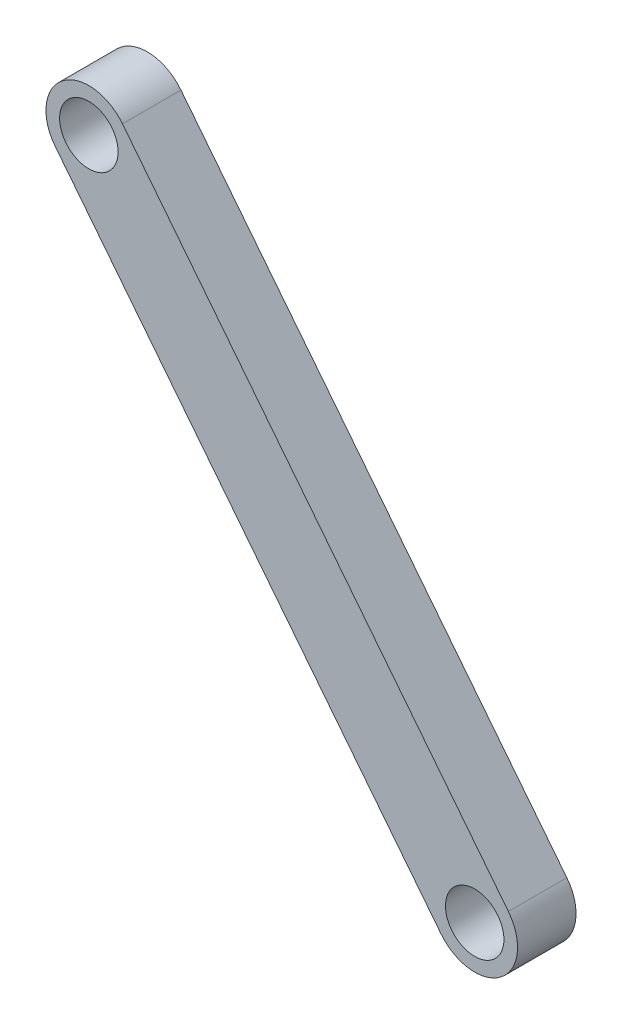
ISO-10303-21;
HEADER;
FILE_DESCRIPTION(('STEP AP214'),'2;1');
FILE_NAME('part.step','',(''),(''),'','','');
FILE_SCHEMA(('AUTOMOTIVE_DESIGN { 1 0 10303 214 1 1 1 1 }'));
ENDSEC;
DATA;
#1=APPLICATION_CONTEXT('core data for automotive mechanical design processes');
#2=APPLICATION_PROTOCOL_DEFINITION('international standard','automotive_design',2000,#1);
#3=PRODUCT_CONTEXT('',#1,'mechanical');
#4=PRODUCT('Part','Part','',(#3));
#5=PRODUCT_RELATED_PRODUCT_CATEGORY('part','',(#4));
#6=PRODUCT_DEFINITION_FORMATION('','',#4);
#7=PRODUCT_DEFINITION_CONTEXT('part definition',#1,'design');
#8=PRODUCT_DEFINITION('design','',#6,#7);
#9=PRODUCT_DEFINITION_SHAPE('','',#8);
#10=(LENGTH_UNIT() NAMED_UNIT(*) SI_UNIT(.MILLI.,.METRE.));
#11=(NAMED_UNIT(*) PLANE_ANGLE_UNIT() SI_UNIT($,.RADIAN.));
#12=(NAMED_UNIT(*) SI_UNIT($,.STERADIAN.) SOLID_ANGLE_UNIT());
#13=UNCERTAINTY_MEASURE_WITH_UNIT(LENGTH_MEASURE(1.E-05),#10,'distance_accuracy_value','');
#14=(GEOMETRIC_REPRESENTATION_CONTEXT(3) GLOBAL_UNCERTAINTY_ASSIGNED_CONTEXT((#13)) GLOBAL_UNIT_ASSIGNED_CONTEXT((#10,
#11,#12)) REPRESENTATION_CONTEXT('',''));
#15=CARTESIAN_POINT('',(0.,0.,0.));
#16=DIRECTION('',(0.,0.,1.));
#17=DIRECTION('',(1.,0.,0.));
#18=AXIS2_PLACEMENT_3D('',#15,#16,#17);
#19=CARTESIAN_POINT('',(0.,0.,3.));
#20=DIRECTION('',(0.,0.,1.));
#21=DIRECTION('',(1.,0.,0.));
#22=AXIS2_PLACEMENT_3D('',#19,#20,#21);
#23=PLANE('',#22);
#24=CARTESIAN_POINT('',(0.,0.,3.));
#25=DIRECTION('',(0.,0.,1.));
#26=DIRECTION('',(1.,0.,0.));
#27=AXIS2_PLACEMENT_3D('',#24,#25,#26);
#28=CIRCLE('',#27,1.5);
#29=CARTESIAN_POINT('',(1.5,0.,3.));
#30=VERTEX_POINT('',#29);
#31=EDGE_CURVE('E108',#30,#30,#28,.T.);
#32=ORIENTED_EDGE('',*,*,#31,.F.);
#33=EDGE_LOOP('',(#32));
#34=FACE_BOUND('',#33,.T.);
#35=CARTESIAN_POINT('',(0.,0.,3.));
#36=DIRECTION('',(0.,0.,1.));
#37=DIRECTION('',(1.,0.,0.));
#38=AXIS2_PLACEMENT_3D('',#35,#36,#37);
#39=CIRCLE('',#38,2.2);
#40=CARTESIAN_POINT('',(1.72727040152047,1.36254796613965,3.));
#41=VERTEX_POINT('',#40);
#42=CARTESIAN_POINT('',(-1.72727040152047,-1.36254796613965,3.));
#43=VERTEX_POINT('',#42);
#44=EDGE_CURVE('E93',#41,#43,#39,.T.);
#45=ORIENTED_EDGE('',*,*,#44,.T.);
#46=DIRECTION('',(0.619339984608934,-0.785122909782033,0.));
#47=VECTOR('',#46,1.);
#48=CARTESIAN_POINT('',(-1.72727040152047,-1.36254796613965,3.));
#49=LINE('',#48,#47);
#50=CARTESIAN_POINT('',(18.0727295984795,-26.4625479661397,3.));
#51=VERTEX_POINT('',#50);
#52=EDGE_CURVE('E88',#43,#51,#49,.T.);
#53=ORIENTED_EDGE('',*,*,#52,.T.);
#54=CARTESIAN_POINT('',(19.8,-25.1,3.));
#55=DIRECTION('',(0.,0.,1.));
#56=DIRECTION('',(1.,0.,0.));
#57=AXIS2_PLACEMENT_3D('',#54,#55,#56);
#58=CIRCLE('',#57,2.2);
#59=CARTESIAN_POINT('',(21.5272704015205,-23.7374520338603,3.));
#60=VERTEX_POINT('',#59);
#61=EDGE_CURVE('E91',#51,#60,#58,.T.);
#62=ORIENTED_EDGE('',*,*,#61,.T.);
#63=DIRECTION('',(-0.619339984608934,0.785122909782032,0.));
#64=VECTOR('',#63,1.);
#65=CARTESIAN_POINT('',(1.72727040152047,1.36254796613965,3.));
#66=LINE('',#65,#64);
#67=EDGE_CURVE('E58',#60,#41,#66,.T.);
#68=ORIENTED_EDGE('',*,*,#67,.T.);
#69=EDGE_LOOP('',(#45,#53,#62,#68));
#70=FACE_BOUND('',#69,.T.);
#71=CARTESIAN_POINT('',(19.8,-25.1,3.));
#72=DIRECTION('',(0.,0.,1.));
#73=DIRECTION('',(1.,0.,0.));
#74=AXIS2_PLACEMENT_3D('',#71,#72,#73);
#75=CIRCLE('',#74,1.5);
#76=CARTESIAN_POINT('',(21.3,-25.1,3.));
#77=VERTEX_POINT('',#76);
#78=EDGE_CURVE('E123',#77,#77,#75,.T.);
#79=ORIENTED_EDGE('',*,*,#78,.F.);
#80=EDGE_LOOP('',(#79));
#81=FACE_BOUND('',#80,.T.);
#82=ADVANCED_FACE('F41',(#34,#70,#81),#23,.T.);
#83=CARTESIAN_POINT('',(0.,0.,0.));
#84=DIRECTION('',(0.,0.,1.));
#85=DIRECTION('',(1.,0.,0.));
#86=AXIS2_PLACEMENT_3D('',#83,#84,#85);
#87=PLANE('',#86);
#88=CARTESIAN_POINT('',(0.,0.,0.));
#89=DIRECTION('',(0.,0.,1.));
#90=DIRECTION('',(1.,0.,0.));
#91=AXIS2_PLACEMENT_3D('',#88,#89,#90);
#92=CIRCLE('',#91,2.2);
#93=CARTESIAN_POINT('',(1.72727040152047,1.36254796613965,0.));
#94=VERTEX_POINT('',#93);
#95=CARTESIAN_POINT('',(-1.72727040152047,-1.36254796613965,0.));
#96=VERTEX_POINT('',#95);
#97=EDGE_CURVE('E105',#94,#96,#92,.T.);
#98=ORIENTED_EDGE('',*,*,#97,.F.);
#99=DIRECTION('',(-0.619339984608934,0.785122909782032,0.));
#100=VECTOR('',#99,1.);
#101=CARTESIAN_POINT('',(1.72727040152047,1.36254796613965,0.));
#102=LINE('',#101,#100);
#103=CARTESIAN_POINT('',(21.5272704015205,-23.7374520338603,0.));
#104=VERTEX_POINT('',#103);
#105=EDGE_CURVE('E81',#104,#94,#102,.T.);
#106=ORIENTED_EDGE('',*,*,#105,.F.);
#107=CARTESIAN_POINT('',(19.8,-25.1,0.));
#108=DIRECTION('',(0.,0.,1.));
#109=DIRECTION('',(1.,0.,0.));
#110=AXIS2_PLACEMENT_3D('',#107,#108,#109);
#111=CIRCLE('',#110,2.2);
#112=CARTESIAN_POINT('',(18.0727295984795,-26.4625479661397,0.));
#113=VERTEX_POINT('',#112);
#114=EDGE_CURVE('E75',#113,#104,#111,.T.);
#115=ORIENTED_EDGE('',*,*,#114,.F.);
#116=DIRECTION('',(0.619339984608934,-0.785122909782033,0.));
#117=VECTOR('',#116,1.);
#118=CARTESIAN_POINT('',(-1.72727040152047,-1.36254796613965,0.));
#119=LINE('',#118,#117);
#120=EDGE_CURVE('E97',#96,#113,#119,.T.);
#121=ORIENTED_EDGE('',*,*,#120,.F.);
#122=EDGE_LOOP('',(#98,#106,#115,#121));
#123=FACE_BOUND('',#122,.T.);
#124=CARTESIAN_POINT('',(0.,0.,0.));
#125=DIRECTION('',(0.,0.,1.));
#126=DIRECTION('',(1.,0.,0.));
#127=AXIS2_PLACEMENT_3D('',#124,#125,#126);
#128=CIRCLE('',#127,1.5);
#129=CARTESIAN_POINT('',(1.5,0.,0.));
#130=VERTEX_POINT('',#129);
#131=EDGE_CURVE('E120',#130,#130,#128,.T.);
#132=ORIENTED_EDGE('',*,*,#131,.T.);
#133=EDGE_LOOP('',(#132));
#134=FACE_BOUND('',#133,.T.);
#135=CARTESIAN_POINT('',(19.8,-25.1,0.));
#136=DIRECTION('',(0.,0.,1.));
#137=DIRECTION('',(1.,0.,0.));
#138=AXIS2_PLACEMENT_3D('',#135,#136,#137);
#139=CIRCLE('',#138,1.5);
#140=CARTESIAN_POINT('',(21.3,-25.1,0.));
#141=VERTEX_POINT('',#140);
#142=EDGE_CURVE('E126',#141,#141,#139,.T.);
#143=ORIENTED_EDGE('',*,*,#142,.T.);
#144=EDGE_LOOP('',(#143));
#145=FACE_BOUND('',#144,.T.);
#146=ADVANCED_FACE('F116',(#123,#134,#145),#87,.F.);
#147=CARTESIAN_POINT('',(0.,0.,3.));
#148=DIRECTION('',(0.,0.,-1.));
#149=DIRECTION('',(-1.,0.,0.));
#150=AXIS2_PLACEMENT_3D('',#147,#148,#149);
#151=CYLINDRICAL_SURFACE('',#150,2.2);
#152=ORIENTED_EDGE('',*,*,#97,.T.);
#153=DIRECTION('',(0.,0.,-1.));
#154=VECTOR('',#153,1.);
#155=CARTESIAN_POINT('',(-1.72727040152047,-1.36254796613965,3.));
#156=LINE('',#155,#154);
#157=EDGE_CURVE('E11',#43,#96,#156,.T.);
#158=ORIENTED_EDGE('',*,*,#157,.F.);
#159=ORIENTED_EDGE('',*,*,#44,.F.);
#160=DIRECTION('',(0.,0.,-1.));
#161=VECTOR('',#160,1.);
#162=CARTESIAN_POINT('',(1.72727040152047,1.36254796613965,3.));
#163=LINE('',#162,#161);
#164=EDGE_CURVE('E101',#41,#94,#163,.T.);
#165=ORIENTED_EDGE('',*,*,#164,.T.);
#166=EDGE_LOOP('',(#152,#158,#159,#165));
#167=FACE_BOUND('',#166,.T.);
#168=ADVANCED_FACE('F43',(#167),#151,.T.);
#169=CARTESIAN_POINT('',(-1.72727040152047,-1.36254796613965,3.));
#170=DIRECTION('',(0.785122909782032,0.619339984608934,0.));
#171=DIRECTION('',(-0.619339984608934,0.785122909782032,0.));
#172=AXIS2_PLACEMENT_3D('',#169,#170,#171);
#173=PLANE('',#172);
#174=ORIENTED_EDGE('',*,*,#120,.T.);
#175=DIRECTION('',(0.,0.,-1.));
#176=VECTOR('',#175,1.);
#177=CARTESIAN_POINT('',(18.0727295984795,-26.4625479661397,3.));
#178=LINE('',#177,#176);
#179=EDGE_CURVE('E50',#51,#113,#178,.T.);
#180=ORIENTED_EDGE('',*,*,#179,.F.);
#181=ORIENTED_EDGE('',*,*,#52,.F.);
#182=ORIENTED_EDGE('',*,*,#157,.T.);
#183=EDGE_LOOP('',(#174,#180,#181,#182));
#184=FACE_BOUND('',#183,.T.);
#185=ADVANCED_FACE('F96',(#184),#173,.F.);
#186=CARTESIAN_POINT('',(19.8,-25.1,3.));
#187=DIRECTION('',(0.,0.,-1.));
#188=DIRECTION('',(-1.,0.,0.));
#189=AXIS2_PLACEMENT_3D('',#186,#187,#188);
#190=CYLINDRICAL_SURFACE('',#189,2.2);
#191=ORIENTED_EDGE('',*,*,#114,.T.);
#192=DIRECTION('',(0.,0.,-1.));
#193=VECTOR('',#192,1.);
#194=CARTESIAN_POINT('',(21.5272704015205,-23.7374520338603,3.));
#195=LINE('',#194,#193);
#196=EDGE_CURVE('E98',#60,#104,#195,.T.);
#197=ORIENTED_EDGE('',*,*,#196,.F.);
#198=ORIENTED_EDGE('',*,*,#61,.F.);
#199=ORIENTED_EDGE('',*,*,#179,.T.);
#200=EDGE_LOOP('',(#191,#197,#198,#199));
#201=FACE_BOUND('',#200,.T.);
#202=ADVANCED_FACE('F99',(#201),#190,.T.);
#203=CARTESIAN_POINT('',(1.72727040152047,1.36254796613965,3.));
#204=DIRECTION('',(-0.785122909782032,-0.619339984608934,0.));
#205=DIRECTION('',(0.619339984608934,-0.785122909782032,0.));
#206=AXIS2_PLACEMENT_3D('',#203,#204,#205);
#207=PLANE('',#206);
#208=ORIENTED_EDGE('',*,*,#105,.T.);
#209=ORIENTED_EDGE('',*,*,#164,.F.);
#210=ORIENTED_EDGE('',*,*,#67,.F.);
#211=ORIENTED_EDGE('',*,*,#196,.T.);
#212=EDGE_LOOP('',(#208,#209,#210,#211));
#213=FACE_BOUND('',#212,.T.);
#214=ADVANCED_FACE('F113',(#213),#207,.F.);
#215=CARTESIAN_POINT('',(0.,0.,3.));
#216=DIRECTION('',(0.,0.,-1.));
#217=DIRECTION('',(-1.,0.,0.));
#218=AXIS2_PLACEMENT_3D('',#215,#216,#217);
#219=CYLINDRICAL_SURFACE('',#218,1.5);
#220=ORIENTED_EDGE('',*,*,#31,.T.);
#221=EDGE_LOOP('',(#220));
#222=FACE_BOUND('',#221,.T.);
#223=ORIENTED_EDGE('',*,*,#131,.F.);
#224=EDGE_LOOP('',(#223));
#225=FACE_BOUND('',#224,.T.);
#226=ADVANCED_FACE('F143',(#222,#225),#219,.F.);
#227=CARTESIAN_POINT('',(19.8,-25.1,3.));
#228=DIRECTION('',(0.,0.,-1.));
#229=DIRECTION('',(-1.,0.,0.));
#230=AXIS2_PLACEMENT_3D('',#227,#228,#229);
#231=CYLINDRICAL_SURFACE('',#230,1.5);
#232=ORIENTED_EDGE('',*,*,#78,.T.);
#233=EDGE_LOOP('',(#232));
#234=FACE_BOUND('',#233,.T.);
#235=ORIENTED_EDGE('',*,*,#142,.F.);
#236=EDGE_LOOP('',(#235));
#237=FACE_BOUND('',#236,.T.);
#238=ADVANCED_FACE('F132',(#234,#237),#231,.F.);
#239=CLOSED_SHELL('',(#82,#146,#168,#185,#202,#214,#226,#238));
#240=MANIFOLD_SOLID_BREP('B2',#239);
#241=ADVANCED_BREP_SHAPE_REPRESENTATION('',(#18,#240),#14);
#242=SHAPE_DEFINITION_REPRESENTATION(#9,#241);
ENDSEC;
END-ISO-10303-21;
